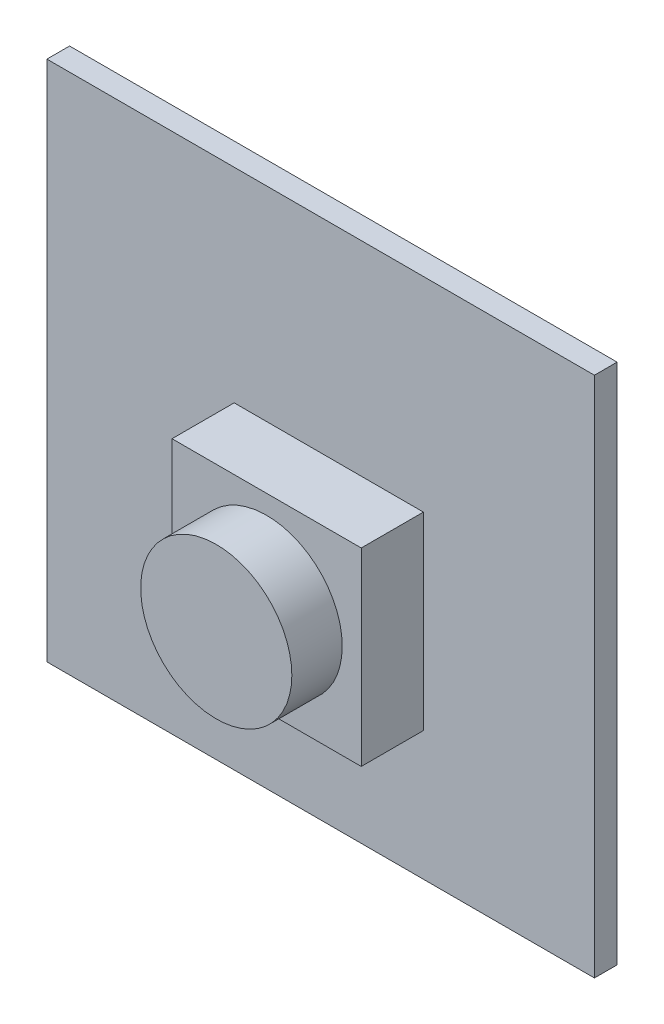
ISO-10303-21;
HEADER;
FILE_DESCRIPTION(('STEP AP214'),'2;1');
FILE_NAME('part.step','',(''),(''),'','','');
FILE_SCHEMA(('AUTOMOTIVE_DESIGN { 1 0 10303 214 1 1 1 1 }'));
ENDSEC;
DATA;
#1=APPLICATION_CONTEXT('core data for automotive mechanical design processes');
#2=APPLICATION_PROTOCOL_DEFINITION('international standard','automotive_design',2000,#1);
#3=PRODUCT_CONTEXT('',#1,'mechanical');
#4=PRODUCT('Part','Part','',(#3));
#5=PRODUCT_RELATED_PRODUCT_CATEGORY('part','',(#4));
#6=PRODUCT_DEFINITION_FORMATION('','',#4);
#7=PRODUCT_DEFINITION_CONTEXT('part definition',#1,'design');
#8=PRODUCT_DEFINITION('design','',#6,#7);
#9=PRODUCT_DEFINITION_SHAPE('','',#8);
#10=(LENGTH_UNIT() NAMED_UNIT(*) SI_UNIT(.MILLI.,.METRE.));
#11=(NAMED_UNIT(*) PLANE_ANGLE_UNIT() SI_UNIT($,.RADIAN.));
#12=(NAMED_UNIT(*) SI_UNIT($,.STERADIAN.) SOLID_ANGLE_UNIT());
#13=UNCERTAINTY_MEASURE_WITH_UNIT(LENGTH_MEASURE(1.E-05),#10,'distance_accuracy_value','');
#14=(GEOMETRIC_REPRESENTATION_CONTEXT(3) GLOBAL_UNCERTAINTY_ASSIGNED_CONTEXT((#13)) GLOBAL_UNIT_ASSIGNED_CONTEXT((#10,
#11,#12)) REPRESENTATION_CONTEXT('',''));
#15=CARTESIAN_POINT('',(0.,0.,0.));
#16=DIRECTION('',(0.,0.,1.));
#17=DIRECTION('',(1.,0.,0.));
#18=AXIS2_PLACEMENT_3D('',#15,#16,#17);
#19=CARTESIAN_POINT('',(0.,0.,3.8481));
#20=DIRECTION('',(0.,0.,1.));
#21=DIRECTION('',(1.,0.,0.));
#22=AXIS2_PLACEMENT_3D('',#19,#20,#21);
#23=PLANE('',#22);
#24=DIRECTION('',(0.,1.,0.));
#25=VECTOR('',#24,1.);
#26=CARTESIAN_POINT('',(4.6609,2.58445,3.8481));
#27=LINE('',#26,#25);
#28=CARTESIAN_POINT('',(4.6609,-6.00075,3.8481));
#29=VERTEX_POINT('',#28);
#30=CARTESIAN_POINT('',(4.6609,2.58445,3.8481));
#31=VERTEX_POINT('',#30);
#32=EDGE_CURVE('E120',#29,#31,#27,.T.);
#33=ORIENTED_EDGE('',*,*,#32,.T.);
#34=DIRECTION('',(-1.,0.,0.));
#35=VECTOR('',#34,1.);
#36=CARTESIAN_POINT('',(-3.9243,2.58445,3.8481));
#37=LINE('',#36,#35);
#38=CARTESIAN_POINT('',(-3.9243,2.58445,3.8481));
#39=VERTEX_POINT('',#38);
#40=EDGE_CURVE('E109',#31,#39,#37,.T.);
#41=ORIENTED_EDGE('',*,*,#40,.T.);
#42=DIRECTION('',(0.,-1.,0.));
#43=VECTOR('',#42,1.);
#44=CARTESIAN_POINT('',(-3.9243,2.58445,3.8481));
#45=LINE('',#44,#43);
#46=CARTESIAN_POINT('',(-3.9243,-6.00075,3.8481));
#47=VERTEX_POINT('',#46);
#48=EDGE_CURVE('E119',#39,#47,#45,.T.);
#49=ORIENTED_EDGE('',*,*,#48,.T.);
#50=DIRECTION('',(1.,0.,0.));
#51=VECTOR('',#50,1.);
#52=CARTESIAN_POINT('',(-3.9243,-6.00075,3.8481));
#53=LINE('',#52,#51);
#54=EDGE_CURVE('E124',#47,#29,#53,.T.);
#55=ORIENTED_EDGE('',*,*,#54,.T.);
#56=EDGE_LOOP('',(#33,#41,#49,#55));
#57=FACE_BOUND('',#56,.T.);
#58=CARTESIAN_POINT('',(0.368300000000002,-1.70815,3.8481));
#59=DIRECTION('',(0.,0.,1.));
#60=DIRECTION('',(1.,0.,0.));
#61=AXIS2_PLACEMENT_3D('',#58,#59,#60);
#62=CIRCLE('',#61,3.429);
#63=CARTESIAN_POINT('',(3.7973,-1.70815,3.8481));
#64=VERTEX_POINT('',#63);
#65=EDGE_CURVE('E302',#64,#64,#62,.T.);
#66=ORIENTED_EDGE('',*,*,#65,.F.);
#67=EDGE_LOOP('',(#66));
#68=FACE_BOUND('',#67,.T.);
#69=ADVANCED_FACE('F35',(#57,#68),#23,.T.);
#70=CARTESIAN_POINT('',(0.,0.,1.0287));
#71=DIRECTION('',(0.,0.,1.));
#72=DIRECTION('',(1.,0.,0.));
#73=AXIS2_PLACEMENT_3D('',#70,#71,#72);
#74=PLANE('',#73);
#75=DIRECTION('',(0.,1.,0.));
#76=VECTOR('',#75,1.);
#77=CARTESIAN_POINT('',(12.4206,11.84275,1.0287));
#78=LINE('',#77,#76);
#79=CARTESIAN_POINT('',(12.4206,-11.84275,1.0287));
#80=VERTEX_POINT('',#79);
#81=CARTESIAN_POINT('',(12.4206,11.84275,1.0287));
#82=VERTEX_POINT('',#81);
#83=EDGE_CURVE('E142',#80,#82,#78,.T.);
#84=ORIENTED_EDGE('',*,*,#83,.T.);
#85=DIRECTION('',(-1.,0.,0.));
#86=VECTOR('',#85,1.);
#87=CARTESIAN_POINT('',(-12.4206,11.84275,1.0287));
#88=LINE('',#87,#86);
#89=CARTESIAN_POINT('',(-12.4206,11.84275,1.0287));
#90=VERTEX_POINT('',#89);
#91=EDGE_CURVE('E87',#82,#90,#88,.T.);
#92=ORIENTED_EDGE('',*,*,#91,.T.);
#93=DIRECTION('',(0.,-1.,0.));
#94=VECTOR('',#93,1.);
#95=CARTESIAN_POINT('',(-12.4206,11.84275,1.0287));
#96=LINE('',#95,#94);
#97=CARTESIAN_POINT('',(-12.4206,-11.84275,1.0287));
#98=VERTEX_POINT('',#97);
#99=EDGE_CURVE('E145',#90,#98,#96,.T.);
#100=ORIENTED_EDGE('',*,*,#99,.T.);
#101=DIRECTION('',(1.,0.,0.));
#102=VECTOR('',#101,1.);
#103=CARTESIAN_POINT('',(-12.4206,-11.84275,1.0287));
#104=LINE('',#103,#102);
#105=EDGE_CURVE('E59',#98,#80,#104,.T.);
#106=ORIENTED_EDGE('',*,*,#105,.T.);
#107=EDGE_LOOP('',(#84,#92,#100,#106));
#108=FACE_BOUND('',#107,.T.);
#109=DIRECTION('',(-1.,0.,0.));
#110=VECTOR('',#109,1.);
#111=CARTESIAN_POINT('',(-3.9243,2.58445,1.0287));
#112=LINE('',#111,#110);
#113=CARTESIAN_POINT('',(4.6609,2.58445,1.0287));
#114=VERTEX_POINT('',#113);
#115=CARTESIAN_POINT('',(-3.9243,2.58445,1.0287));
#116=VERTEX_POINT('',#115);
#117=EDGE_CURVE('E304',#114,#116,#112,.T.);
#118=ORIENTED_EDGE('',*,*,#117,.F.);
#119=DIRECTION('',(0.,1.,0.));
#120=VECTOR('',#119,1.);
#121=CARTESIAN_POINT('',(4.6609,2.58445,1.0287));
#122=LINE('',#121,#120);
#123=CARTESIAN_POINT('',(4.6609,-6.00075,1.0287));
#124=VERTEX_POINT('',#123);
#125=EDGE_CURVE('E132',#124,#114,#122,.T.);
#126=ORIENTED_EDGE('',*,*,#125,.F.);
#127=DIRECTION('',(1.,0.,0.));
#128=VECTOR('',#127,1.);
#129=CARTESIAN_POINT('',(-3.9243,-6.00075,1.0287));
#130=LINE('',#129,#128);
#131=CARTESIAN_POINT('',(-3.9243,-6.00075,1.0287));
#132=VERTEX_POINT('',#131);
#133=EDGE_CURVE('E128',#132,#124,#130,.T.);
#134=ORIENTED_EDGE('',*,*,#133,.F.);
#135=DIRECTION('',(0.,-1.,0.));
#136=VECTOR('',#135,1.);
#137=CARTESIAN_POINT('',(-3.9243,2.58445,1.0287));
#138=LINE('',#137,#136);
#139=EDGE_CURVE('E313',#116,#132,#138,.T.);
#140=ORIENTED_EDGE('',*,*,#139,.F.);
#141=EDGE_LOOP('',(#118,#126,#134,#140));
#142=FACE_BOUND('',#141,.T.);
#143=ADVANCED_FACE('F178',(#108,#142),#74,.T.);
#144=CARTESIAN_POINT('',(12.4206,11.84275,1.0287));
#145=DIRECTION('',(-1.,0.,0.));
#146=DIRECTION('',(0.,-1.,0.));
#147=AXIS2_PLACEMENT_3D('',#144,#145,#146);
#148=PLANE('',#147);
#149=DIRECTION('',(0.,1.,0.));
#150=VECTOR('',#149,1.);
#151=CARTESIAN_POINT('',(12.4206,11.84275,0.));
#152=LINE('',#151,#150);
#153=CARTESIAN_POINT('',(12.4206,-11.84275,0.));
#154=VERTEX_POINT('',#153);
#155=CARTESIAN_POINT('',(12.4206,11.84275,0.));
#156=VERTEX_POINT('',#155);
#157=EDGE_CURVE('E134',#154,#156,#152,.T.);
#158=ORIENTED_EDGE('',*,*,#157,.T.);
#159=DIRECTION('',(0.,0.,-1.));
#160=VECTOR('',#159,1.);
#161=CARTESIAN_POINT('',(12.4206,11.84275,1.0287));
#162=LINE('',#161,#160);
#163=EDGE_CURVE('E11',#82,#156,#162,.T.);
#164=ORIENTED_EDGE('',*,*,#163,.F.);
#165=ORIENTED_EDGE('',*,*,#83,.F.);
#166=DIRECTION('',(0.,0.,-1.));
#167=VECTOR('',#166,1.);
#168=CARTESIAN_POINT('',(12.4206,-11.84275,1.0287));
#169=LINE('',#168,#167);
#170=EDGE_CURVE('E147',#80,#154,#169,.T.);
#171=ORIENTED_EDGE('',*,*,#170,.T.);
#172=EDGE_LOOP('',(#158,#164,#165,#171));
#173=FACE_BOUND('',#172,.T.);
#174=ADVANCED_FACE('F37',(#173),#148,.F.);
#175=CARTESIAN_POINT('',(-12.4206,11.84275,1.0287));
#176=DIRECTION('',(0.,-1.,0.));
#177=DIRECTION('',(0.,0.,-1.));
#178=AXIS2_PLACEMENT_3D('',#175,#176,#177);
#179=PLANE('',#178);
#180=DIRECTION('',(-1.,0.,0.));
#181=VECTOR('',#180,1.);
#182=CARTESIAN_POINT('',(-12.4206,11.84275,0.));
#183=LINE('',#182,#181);
#184=CARTESIAN_POINT('',(-12.4206,11.84275,0.));
#185=VERTEX_POINT('',#184);
#186=EDGE_CURVE('E137',#156,#185,#183,.T.);
#187=ORIENTED_EDGE('',*,*,#186,.T.);
#188=DIRECTION('',(0.,0.,-1.));
#189=VECTOR('',#188,1.);
#190=CARTESIAN_POINT('',(-12.4206,11.84275,1.0287));
#191=LINE('',#190,#189);
#192=EDGE_CURVE('E43',#90,#185,#191,.T.);
#193=ORIENTED_EDGE('',*,*,#192,.F.);
#194=ORIENTED_EDGE('',*,*,#91,.F.);
#195=ORIENTED_EDGE('',*,*,#163,.T.);
#196=EDGE_LOOP('',(#187,#193,#194,#195));
#197=FACE_BOUND('',#196,.T.);
#198=ADVANCED_FACE('F175',(#197),#179,.F.);
#199=CARTESIAN_POINT('',(-12.4206,11.84275,1.0287));
#200=DIRECTION('',(1.,0.,0.));
#201=DIRECTION('',(0.,1.,0.));
#202=AXIS2_PLACEMENT_3D('',#199,#200,#201);
#203=PLANE('',#202);
#204=DIRECTION('',(0.,-1.,0.));
#205=VECTOR('',#204,1.);
#206=CARTESIAN_POINT('',(-12.4206,11.84275,0.));
#207=LINE('',#206,#205);
#208=CARTESIAN_POINT('',(-12.4206,-11.84275,0.));
#209=VERTEX_POINT('',#208);
#210=EDGE_CURVE('E150',#185,#209,#207,.T.);
#211=ORIENTED_EDGE('',*,*,#210,.T.);
#212=DIRECTION('',(0.,0.,-1.));
#213=VECTOR('',#212,1.);
#214=CARTESIAN_POINT('',(-12.4206,-11.84275,1.0287));
#215=LINE('',#214,#213);
#216=EDGE_CURVE('E154',#98,#209,#215,.T.);
#217=ORIENTED_EDGE('',*,*,#216,.F.);
#218=ORIENTED_EDGE('',*,*,#99,.F.);
#219=ORIENTED_EDGE('',*,*,#192,.T.);
#220=EDGE_LOOP('',(#211,#217,#218,#219));
#221=FACE_BOUND('',#220,.T.);
#222=ADVANCED_FACE('F159',(#221),#203,.F.);
#223=CARTESIAN_POINT('',(-12.4206,-11.84275,1.0287));
#224=DIRECTION('',(0.,1.,0.));
#225=DIRECTION('',(0.,0.,1.));
#226=AXIS2_PLACEMENT_3D('',#223,#224,#225);
#227=PLANE('',#226);
#228=DIRECTION('',(1.,0.,0.));
#229=VECTOR('',#228,1.);
#230=CARTESIAN_POINT('',(-12.4206,-11.84275,0.));
#231=LINE('',#230,#229);
#232=EDGE_CURVE('E80',#209,#154,#231,.T.);
#233=ORIENTED_EDGE('',*,*,#232,.T.);
#234=ORIENTED_EDGE('',*,*,#170,.F.);
#235=ORIENTED_EDGE('',*,*,#105,.F.);
#236=ORIENTED_EDGE('',*,*,#216,.T.);
#237=EDGE_LOOP('',(#233,#234,#235,#236));
#238=FACE_BOUND('',#237,.T.);
#239=ADVANCED_FACE('F167',(#238),#227,.F.);
#240=CARTESIAN_POINT('',(0.,0.,0.));
#241=DIRECTION('',(0.,0.,1.));
#242=DIRECTION('',(1.,0.,0.));
#243=AXIS2_PLACEMENT_3D('',#240,#241,#242);
#244=PLANE('',#243);
#245=ORIENTED_EDGE('',*,*,#157,.F.);
#246=ORIENTED_EDGE('',*,*,#232,.F.);
#247=ORIENTED_EDGE('',*,*,#210,.F.);
#248=ORIENTED_EDGE('',*,*,#186,.F.);
#249=EDGE_LOOP('',(#245,#246,#247,#248));
#250=FACE_BOUND('',#249,.T.);
#251=ADVANCED_FACE('F163',(#250),#244,.F.);
#252=CARTESIAN_POINT('',(4.6609,2.58445,3.8481));
#253=DIRECTION('',(-1.,0.,0.));
#254=DIRECTION('',(0.,-1.,0.));
#255=AXIS2_PLACEMENT_3D('',#252,#253,#254);
#256=PLANE('',#255);
#257=ORIENTED_EDGE('',*,*,#125,.T.);
#258=DIRECTION('',(0.,0.,-1.));
#259=VECTOR('',#258,1.);
#260=CARTESIAN_POINT('',(4.6609,2.58445,3.8481));
#261=LINE('',#260,#259);
#262=EDGE_CURVE('E113',#31,#114,#261,.T.);
#263=ORIENTED_EDGE('',*,*,#262,.F.);
#264=ORIENTED_EDGE('',*,*,#32,.F.);
#265=DIRECTION('',(0.,0.,-1.));
#266=VECTOR('',#265,1.);
#267=CARTESIAN_POINT('',(4.6609,-6.00075,3.8481));
#268=LINE('',#267,#266);
#269=EDGE_CURVE('E310',#29,#124,#268,.T.);
#270=ORIENTED_EDGE('',*,*,#269,.T.);
#271=EDGE_LOOP('',(#257,#263,#264,#270));
#272=FACE_BOUND('',#271,.T.);
#273=ADVANCED_FACE('F130',(#272),#256,.F.);
#274=CARTESIAN_POINT('',(-3.9243,2.58445,3.8481));
#275=DIRECTION('',(0.,-1.,0.));
#276=DIRECTION('',(0.,0.,-1.));
#277=AXIS2_PLACEMENT_3D('',#274,#275,#276);
#278=PLANE('',#277);
#279=ORIENTED_EDGE('',*,*,#117,.T.);
#280=DIRECTION('',(0.,0.,-1.));
#281=VECTOR('',#280,1.);
#282=CARTESIAN_POINT('',(-3.9243,2.58445,3.8481));
#283=LINE('',#282,#281);
#284=EDGE_CURVE('E116',#39,#116,#283,.T.);
#285=ORIENTED_EDGE('',*,*,#284,.F.);
#286=ORIENTED_EDGE('',*,*,#40,.F.);
#287=ORIENTED_EDGE('',*,*,#262,.T.);
#288=EDGE_LOOP('',(#279,#285,#286,#287));
#289=FACE_BOUND('',#288,.T.);
#290=ADVANCED_FACE('F111',(#289),#278,.F.);
#291=CARTESIAN_POINT('',(-3.9243,2.58445,3.8481));
#292=DIRECTION('',(1.,0.,0.));
#293=DIRECTION('',(0.,1.,0.));
#294=AXIS2_PLACEMENT_3D('',#291,#292,#293);
#295=PLANE('',#294);
#296=ORIENTED_EDGE('',*,*,#139,.T.);
#297=DIRECTION('',(0.,0.,-1.));
#298=VECTOR('',#297,1.);
#299=CARTESIAN_POINT('',(-3.9243,-6.00075,3.8481));
#300=LINE('',#299,#298);
#301=EDGE_CURVE('E50',#47,#132,#300,.T.);
#302=ORIENTED_EDGE('',*,*,#301,.F.);
#303=ORIENTED_EDGE('',*,*,#48,.F.);
#304=ORIENTED_EDGE('',*,*,#284,.T.);
#305=EDGE_LOOP('',(#296,#302,#303,#304));
#306=FACE_BOUND('',#305,.T.);
#307=ADVANCED_FACE('F191',(#306),#295,.F.);
#308=CARTESIAN_POINT('',(-3.9243,-6.00075,3.8481));
#309=DIRECTION('',(0.,1.,0.));
#310=DIRECTION('',(0.,0.,1.));
#311=AXIS2_PLACEMENT_3D('',#308,#309,#310);
#312=PLANE('',#311);
#313=ORIENTED_EDGE('',*,*,#133,.T.);
#314=ORIENTED_EDGE('',*,*,#269,.F.);
#315=ORIENTED_EDGE('',*,*,#54,.F.);
#316=ORIENTED_EDGE('',*,*,#301,.T.);
#317=EDGE_LOOP('',(#313,#314,#315,#316));
#318=FACE_BOUND('',#317,.T.);
#319=ADVANCED_FACE('F188',(#318),#312,.F.);
#320=CARTESIAN_POINT('',(0.368300000000002,-1.70815,6.1341));
#321=DIRECTION('',(0.,0.,-1.));
#322=DIRECTION('',(-1.,0.,0.));
#323=AXIS2_PLACEMENT_3D('',#320,#321,#322);
#324=CYLINDRICAL_SURFACE('',#323,3.429);
#325=CARTESIAN_POINT('',(0.368300000000002,-1.70815,6.1341));
#326=DIRECTION('',(0.,0.,1.));
#327=DIRECTION('',(1.,0.,0.));
#328=AXIS2_PLACEMENT_3D('',#325,#326,#327);
#329=CIRCLE('',#328,3.429);
#330=CARTESIAN_POINT('',(3.7973,-1.70815,6.1341));
#331=VERTEX_POINT('',#330);
#332=EDGE_CURVE('E301',#331,#331,#329,.T.);
#333=ORIENTED_EDGE('',*,*,#332,.F.);
#334=EDGE_LOOP('',(#333));
#335=FACE_BOUND('',#334,.T.);
#336=ORIENTED_EDGE('',*,*,#65,.T.);
#337=EDGE_LOOP('',(#336));
#338=FACE_BOUND('',#337,.T.);
#339=ADVANCED_FACE('F186',(#335,#338),#324,.T.);
#340=CARTESIAN_POINT('',(0.368300000000002,-1.70815,6.1341));
#341=DIRECTION('',(0.,0.,1.));
#342=DIRECTION('',(1.,0.,0.));
#343=AXIS2_PLACEMENT_3D('',#340,#341,#342);
#344=PLANE('',#343);
#345=ORIENTED_EDGE('',*,*,#332,.T.);
#346=EDGE_LOOP('',(#345));
#347=FACE_BOUND('',#346,.T.);
#348=ADVANCED_FACE('F220',(#347),#344,.T.);
#349=CLOSED_SHELL('',(#69,#143,#174,#198,#222,#239,#251,#273,#290,#307,#319,#339,#348));
#350=MANIFOLD_SOLID_BREP('B2',#349);
#351=ADVANCED_BREP_SHAPE_REPRESENTATION('',(#18,#350),#14);
#352=SHAPE_DEFINITION_REPRESENTATION(#9,#351);
ENDSEC;
END-ISO-10303-21;
